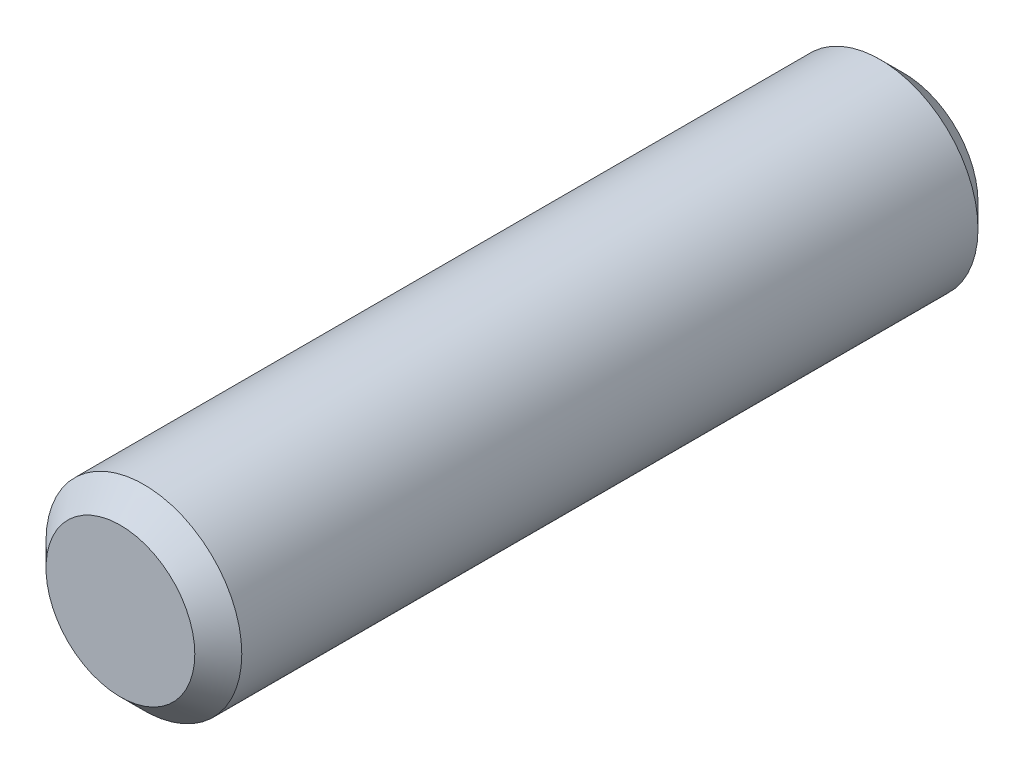
ISO-10303-21;
HEADER;
FILE_DESCRIPTION(('STEP AP214'),'2;1');
FILE_NAME('part.step','',(''),(''),'','','');
FILE_SCHEMA(('AUTOMOTIVE_DESIGN { 1 0 10303 214 1 1 1 1 }'));
ENDSEC;
DATA;
#1=APPLICATION_CONTEXT('core data for automotive mechanical design processes');
#2=APPLICATION_PROTOCOL_DEFINITION('international standard','automotive_design',2000,#1);
#3=PRODUCT_CONTEXT('',#1,'mechanical');
#4=PRODUCT('Part','Part','',(#3));
#5=PRODUCT_RELATED_PRODUCT_CATEGORY('part','',(#4));
#6=PRODUCT_DEFINITION_FORMATION('','',#4);
#7=PRODUCT_DEFINITION_CONTEXT('part definition',#1,'design');
#8=PRODUCT_DEFINITION('design','',#6,#7);
#9=PRODUCT_DEFINITION_SHAPE('','',#8);
#10=(LENGTH_UNIT() NAMED_UNIT(*) SI_UNIT(.MILLI.,.METRE.));
#11=(NAMED_UNIT(*) PLANE_ANGLE_UNIT() SI_UNIT($,.RADIAN.));
#12=(NAMED_UNIT(*) SI_UNIT($,.STERADIAN.) SOLID_ANGLE_UNIT());
#13=UNCERTAINTY_MEASURE_WITH_UNIT(LENGTH_MEASURE(1.E-05),#10,'distance_accuracy_value','');
#14=(GEOMETRIC_REPRESENTATION_CONTEXT(3) GLOBAL_UNCERTAINTY_ASSIGNED_CONTEXT((#13)) GLOBAL_UNIT_ASSIGNED_CONTEXT((#10,
#11,#12)) REPRESENTATION_CONTEXT('',''));
#15=CARTESIAN_POINT('',(0.,0.,0.));
#16=DIRECTION('',(0.,0.,1.));
#17=DIRECTION('',(1.,0.,0.));
#18=AXIS2_PLACEMENT_3D('',#15,#16,#17);
#19=CARTESIAN_POINT('',(0.,0.,25.4));
#20=DIRECTION('',(0.,0.,-1.));
#21=DIRECTION('',(-1.,0.,0.));
#22=AXIS2_PLACEMENT_3D('',#19,#20,#21);
#23=CYLINDRICAL_SURFACE('',#22,3.175);
#24=CARTESIAN_POINT('',(0.,0.,0.762000000000002));
#25=DIRECTION('',(0.,0.,1.));
#26=DIRECTION('',(1.,0.,0.));
#27=AXIS2_PLACEMENT_3D('',#24,#25,#26);
#28=CIRCLE('',#27,3.175);
#29=CARTESIAN_POINT('',(3.175,0.,0.762000000000002));
#30=VERTEX_POINT('',#29);
#31=EDGE_CURVE('E57',#30,#30,#28,.T.);
#32=ORIENTED_EDGE('',*,*,#31,.T.);
#33=EDGE_LOOP('',(#32));
#34=FACE_BOUND('',#33,.T.);
#35=CARTESIAN_POINT('',(0.,0.,24.638));
#36=DIRECTION('',(0.,0.,1.));
#37=DIRECTION('',(1.,0.,0.));
#38=AXIS2_PLACEMENT_3D('',#35,#36,#37);
#39=CIRCLE('',#38,3.175);
#40=CARTESIAN_POINT('',(3.175,0.,24.638));
#41=VERTEX_POINT('',#40);
#42=EDGE_CURVE('E62',#41,#41,#39,.F.);
#43=ORIENTED_EDGE('',*,*,#42,.T.);
#44=EDGE_LOOP('',(#43));
#45=FACE_BOUND('',#44,.T.);
#46=ADVANCED_FACE('F43',(#34,#45),#23,.T.);
#47=CARTESIAN_POINT('',(0.,0.,25.4));
#48=DIRECTION('',(0.,0.,1.));
#49=DIRECTION('',(1.,0.,0.));
#50=AXIS2_PLACEMENT_3D('',#47,#48,#49);
#51=PLANE('',#50);
#52=CARTESIAN_POINT('',(0.,0.,25.4));
#53=DIRECTION('',(0.,0.,1.));
#54=DIRECTION('',(1.,0.,0.));
#55=AXIS2_PLACEMENT_3D('',#52,#53,#54);
#56=CIRCLE('',#55,2.413);
#57=CARTESIAN_POINT('',(2.413,0.,25.4));
#58=VERTEX_POINT('',#57);
#59=EDGE_CURVE('E10',#58,#58,#56,.T.);
#60=ORIENTED_EDGE('',*,*,#59,.T.);
#61=EDGE_LOOP('',(#60));
#62=FACE_BOUND('',#61,.T.);
#63=ADVANCED_FACE('F79',(#62),#51,.T.);
#64=CARTESIAN_POINT('',(0.,0.,0.));
#65=DIRECTION('',(0.,0.,1.));
#66=DIRECTION('',(1.,0.,0.));
#67=AXIS2_PLACEMENT_3D('',#64,#65,#66);
#68=PLANE('',#67);
#69=CARTESIAN_POINT('',(0.,0.,0.));
#70=DIRECTION('',(0.,0.,1.));
#71=DIRECTION('',(1.,0.,0.));
#72=AXIS2_PLACEMENT_3D('',#69,#70,#71);
#73=CIRCLE('',#72,2.413);
#74=CARTESIAN_POINT('',(2.413,0.,0.));
#75=VERTEX_POINT('',#74);
#76=EDGE_CURVE('E52',#75,#75,#73,.F.);
#77=ORIENTED_EDGE('',*,*,#76,.T.);
#78=EDGE_LOOP('',(#77));
#79=FACE_BOUND('',#78,.T.);
#80=ADVANCED_FACE('F76',(#79),#68,.F.);
#81=CARTESIAN_POINT('',(0.,0.,0.762000000000002));
#82=DIRECTION('',(0.,0.,1.));
#83=DIRECTION('',(1.,0.,0.));
#84=AXIS2_PLACEMENT_3D('',#81,#82,#83);
#85=CONICAL_SURFACE('',#84,3.175,0.78539816339745);
#86=ORIENTED_EDGE('',*,*,#76,.F.);
#87=EDGE_LOOP('',(#86));
#88=FACE_BOUND('',#87,.T.);
#89=ORIENTED_EDGE('',*,*,#31,.F.);
#90=EDGE_LOOP('',(#89));
#91=FACE_BOUND('',#90,.T.);
#92=ADVANCED_FACE('F72',(#88,#91),#85,.T.);
#93=CARTESIAN_POINT('',(0.,0.,25.4));
#94=DIRECTION('',(0.,0.,-1.));
#95=DIRECTION('',(-1.,0.,0.));
#96=AXIS2_PLACEMENT_3D('',#93,#94,#95);
#97=CONICAL_SURFACE('',#96,2.413,0.78539816339745);
#98=ORIENTED_EDGE('',*,*,#42,.F.);
#99=EDGE_LOOP('',(#98));
#100=FACE_BOUND('',#99,.T.);
#101=ORIENTED_EDGE('',*,*,#59,.F.);
#102=EDGE_LOOP('',(#101));
#103=FACE_BOUND('',#102,.T.);
#104=ADVANCED_FACE('F46',(#100,#103),#97,.T.);
#105=CLOSED_SHELL('',(#46,#63,#80,#92,#104));
#106=MANIFOLD_SOLID_BREP('B2',#105);
#107=ADVANCED_BREP_SHAPE_REPRESENTATION('',(#18,#106),#14);
#108=SHAPE_DEFINITION_REPRESENTATION(#9,#107);
ENDSEC;
END-ISO-10303-21;
